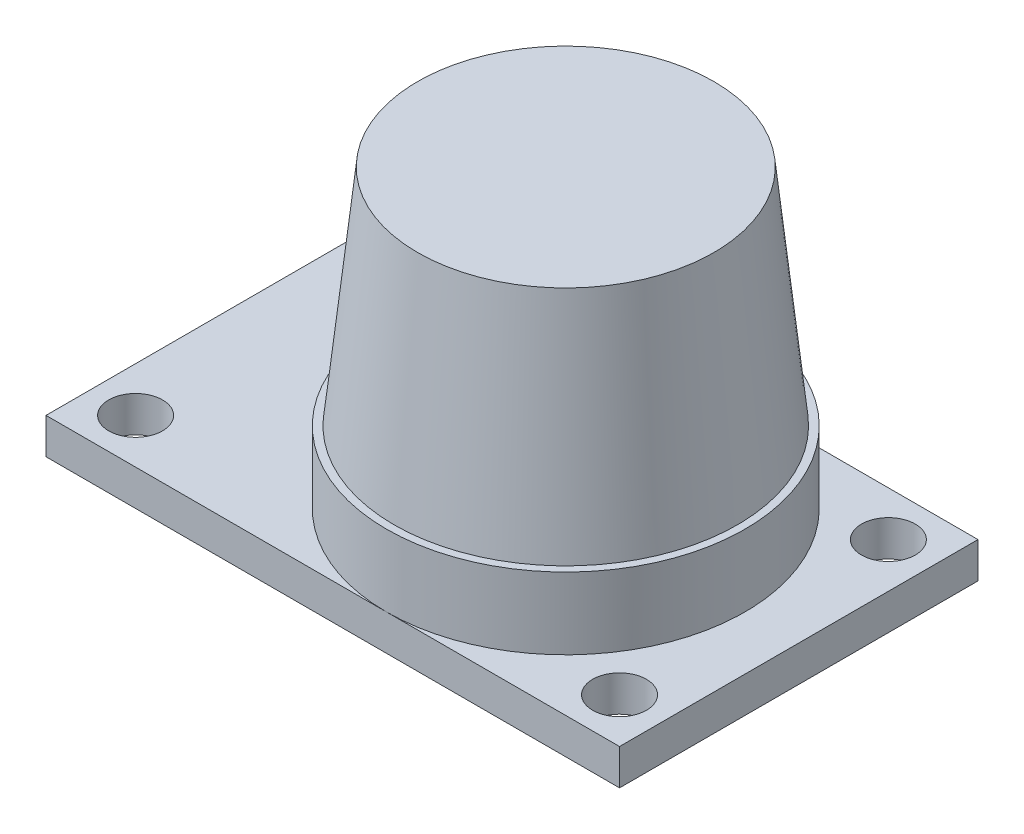
ISO-10303-21;
HEADER;
FILE_DESCRIPTION(('STEP AP214'),'2;1');
FILE_NAME('part.step','',(''),(''),'','','');
FILE_SCHEMA(('AUTOMOTIVE_DESIGN { 1 0 10303 214 1 1 1 1 }'));
ENDSEC;
DATA;
#1=APPLICATION_CONTEXT('core data for automotive mechanical design processes');
#2=APPLICATION_PROTOCOL_DEFINITION('international standard','automotive_design',2000,#1);
#3=PRODUCT_CONTEXT('',#1,'mechanical');
#4=PRODUCT('Part','Part','',(#3));
#5=PRODUCT_RELATED_PRODUCT_CATEGORY('part','',(#4));
#6=PRODUCT_DEFINITION_FORMATION('','',#4);
#7=PRODUCT_DEFINITION_CONTEXT('part definition',#1,'design');
#8=PRODUCT_DEFINITION('design','',#6,#7);
#9=PRODUCT_DEFINITION_SHAPE('','',#8);
#10=(LENGTH_UNIT() NAMED_UNIT(*) SI_UNIT(.MILLI.,.METRE.));
#11=(NAMED_UNIT(*) PLANE_ANGLE_UNIT() SI_UNIT($,.RADIAN.));
#12=(NAMED_UNIT(*) SI_UNIT($,.STERADIAN.) SOLID_ANGLE_UNIT());
#13=UNCERTAINTY_MEASURE_WITH_UNIT(LENGTH_MEASURE(1.E-05),#10,'distance_accuracy_value','');
#14=(GEOMETRIC_REPRESENTATION_CONTEXT(3) GLOBAL_UNCERTAINTY_ASSIGNED_CONTEXT((#13)) GLOBAL_UNIT_ASSIGNED_CONTEXT((#10,
#11,#12)) REPRESENTATION_CONTEXT('',''));
#15=CARTESIAN_POINT('',(0.,0.,0.));
#16=DIRECTION('',(0.,0.,1.));
#17=DIRECTION('',(1.,0.,0.));
#18=AXIS2_PLACEMENT_3D('',#15,#16,#17);
#19=CARTESIAN_POINT('',(0.,2.,0.));
#20=DIRECTION('',(0.,-1.,0.));
#21=DIRECTION('',(0.,0.,-1.));
#22=AXIS2_PLACEMENT_3D('',#19,#20,#21);
#23=PLANE('',#22);
#24=CARTESIAN_POINT('',(3.,2.,0.));
#25=DIRECTION('',(0.,1.,0.));
#26=DIRECTION('',(0.,0.,1.));
#27=AXIS2_PLACEMENT_3D('',#24,#25,#26);
#28=CIRCLE('',#27,10.);
#29=CARTESIAN_POINT('',(3.,2.,10.));
#30=VERTEX_POINT('',#29);
#31=CARTESIAN_POINT('',(3.,2.,-10.));
#32=VERTEX_POINT('',#31);
#33=EDGE_CURVE('E44',#30,#32,#28,.T.);
#34=ORIENTED_EDGE('',*,*,#33,.F.);
#35=DIRECTION('',(1.,0.,0.));
#36=VECTOR('',#35,1.);
#37=CARTESIAN_POINT('',(-16.,2.,10.));
#38=LINE('',#37,#36);
#39=CARTESIAN_POINT('',(16.,2.,10.));
#40=VERTEX_POINT('',#39);
#41=EDGE_CURVE('E58',#30,#40,#38,.T.);
#42=ORIENTED_EDGE('',*,*,#41,.T.);
#43=DIRECTION('',(0.,0.,-1.));
#44=VECTOR('',#43,1.);
#45=CARTESIAN_POINT('',(16.,2.,10.));
#46=LINE('',#45,#44);
#47=CARTESIAN_POINT('',(16.,2.,-10.));
#48=VERTEX_POINT('',#47);
#49=EDGE_CURVE('E162',#40,#48,#46,.T.);
#50=ORIENTED_EDGE('',*,*,#49,.T.);
#51=DIRECTION('',(-1.,0.,0.));
#52=VECTOR('',#51,1.);
#53=CARTESIAN_POINT('',(-16.,2.,-10.));
#54=LINE('',#53,#52);
#55=EDGE_CURVE('E87',#48,#32,#54,.T.);
#56=ORIENTED_EDGE('',*,*,#55,.T.);
#57=EDGE_LOOP('',(#34,#42,#50,#56));
#58=FACE_BOUND('',#57,.T.);
#59=CARTESIAN_POINT('',(13.5,2.,7.5));
#60=DIRECTION('',(0.,1.,0.));
#61=DIRECTION('',(0.,0.,1.));
#62=AXIS2_PLACEMENT_3D('',#59,#60,#61);
#63=CIRCLE('',#62,1.5);
#64=CARTESIAN_POINT('',(13.5,2.,9.));
#65=VERTEX_POINT('',#64);
#66=EDGE_CURVE('E188',#65,#65,#63,.T.);
#67=ORIENTED_EDGE('',*,*,#66,.F.);
#68=EDGE_LOOP('',(#67));
#69=FACE_BOUND('',#68,.T.);
#70=CARTESIAN_POINT('',(13.5,2.,-7.5));
#71=DIRECTION('',(0.,1.,0.));
#72=DIRECTION('',(0.,0.,1.));
#73=AXIS2_PLACEMENT_3D('',#70,#71,#72);
#74=CIRCLE('',#73,1.5);
#75=CARTESIAN_POINT('',(13.5,2.,-6.));
#76=VERTEX_POINT('',#75);
#77=EDGE_CURVE('E177',#76,#76,#74,.T.);
#78=ORIENTED_EDGE('',*,*,#77,.F.);
#79=EDGE_LOOP('',(#78));
#80=FACE_BOUND('',#79,.T.);
#81=ADVANCED_FACE('F33',(#58,#69,#80),#23,.F.);
#82=EDGE_CURVE('E11',#32,#30,#28,.T.);
#83=ORIENTED_EDGE('',*,*,#82,.F.);
#84=CARTESIAN_POINT('',(-16.,2.,-10.));
#85=VERTEX_POINT('',#84);
#86=EDGE_CURVE('E174',#32,#85,#54,.T.);
#87=ORIENTED_EDGE('',*,*,#86,.T.);
#88=DIRECTION('',(0.,0.,1.));
#89=VECTOR('',#88,1.);
#90=CARTESIAN_POINT('',(-16.,2.,10.));
#91=LINE('',#90,#89);
#92=CARTESIAN_POINT('',(-16.,2.,10.));
#93=VERTEX_POINT('',#92);
#94=EDGE_CURVE('E98',#85,#93,#91,.T.);
#95=ORIENTED_EDGE('',*,*,#94,.T.);
#96=EDGE_CURVE('E95',#93,#30,#38,.T.);
#97=ORIENTED_EDGE('',*,*,#96,.T.);
#98=EDGE_LOOP('',(#83,#87,#95,#97));
#99=FACE_BOUND('',#98,.T.);
#100=CARTESIAN_POINT('',(-13.5,2.,-7.5));
#101=DIRECTION('',(0.,1.,0.));
#102=DIRECTION('',(0.,0.,1.));
#103=AXIS2_PLACEMENT_3D('',#100,#101,#102);
#104=CIRCLE('',#103,1.5);
#105=CARTESIAN_POINT('',(-13.5,2.,-6.));
#106=VERTEX_POINT('',#105);
#107=EDGE_CURVE('E167',#106,#106,#104,.T.);
#108=ORIENTED_EDGE('',*,*,#107,.F.);
#109=EDGE_LOOP('',(#108));
#110=FACE_BOUND('',#109,.T.);
#111=CARTESIAN_POINT('',(-13.5,2.,7.5));
#112=DIRECTION('',(0.,1.,0.));
#113=DIRECTION('',(0.,0.,1.));
#114=AXIS2_PLACEMENT_3D('',#111,#112,#113);
#115=CIRCLE('',#114,1.5);
#116=CARTESIAN_POINT('',(-13.5,2.,9.));
#117=VERTEX_POINT('',#116);
#118=EDGE_CURVE('E182',#117,#117,#115,.T.);
#119=ORIENTED_EDGE('',*,*,#118,.F.);
#120=EDGE_LOOP('',(#119));
#121=FACE_BOUND('',#120,.T.);
#122=ADVANCED_FACE('F100',(#99,#110,#121),#23,.F.);
#123=CARTESIAN_POINT('',(0.,0.,0.));
#124=DIRECTION('',(0.,-1.,0.));
#125=DIRECTION('',(0.,0.,-1.));
#126=AXIS2_PLACEMENT_3D('',#123,#124,#125);
#127=PLANE('',#126);
#128=CARTESIAN_POINT('',(-13.5,0.,7.5));
#129=DIRECTION('',(0.,1.,0.));
#130=DIRECTION('',(0.,0.,1.));
#131=AXIS2_PLACEMENT_3D('',#128,#129,#130);
#132=CIRCLE('',#131,1.5);
#133=CARTESIAN_POINT('',(-13.5,0.,9.));
#134=VERTEX_POINT('',#133);
#135=EDGE_CURVE('E185',#134,#134,#132,.T.);
#136=ORIENTED_EDGE('',*,*,#135,.T.);
#137=EDGE_LOOP('',(#136));
#138=FACE_BOUND('',#137,.T.);
#139=CARTESIAN_POINT('',(-13.5,0.,-7.5));
#140=DIRECTION('',(0.,1.,0.));
#141=DIRECTION('',(0.,0.,1.));
#142=AXIS2_PLACEMENT_3D('',#139,#140,#141);
#143=CIRCLE('',#142,1.5);
#144=CARTESIAN_POINT('',(-13.5,0.,-6.));
#145=VERTEX_POINT('',#144);
#146=EDGE_CURVE('E169',#145,#145,#143,.T.);
#147=ORIENTED_EDGE('',*,*,#146,.T.);
#148=EDGE_LOOP('',(#147));
#149=FACE_BOUND('',#148,.T.);
#150=DIRECTION('',(0.,0.,-1.));
#151=VECTOR('',#150,1.);
#152=CARTESIAN_POINT('',(16.,0.,10.));
#153=LINE('',#152,#151);
#154=CARTESIAN_POINT('',(16.,0.,10.));
#155=VERTEX_POINT('',#154);
#156=CARTESIAN_POINT('',(16.,0.,-10.));
#157=VERTEX_POINT('',#156);
#158=EDGE_CURVE('E156',#155,#157,#153,.T.);
#159=ORIENTED_EDGE('',*,*,#158,.F.);
#160=DIRECTION('',(1.,0.,0.));
#161=VECTOR('',#160,1.);
#162=CARTESIAN_POINT('',(-16.,0.,10.));
#163=LINE('',#162,#161);
#164=CARTESIAN_POINT('',(-16.,0.,10.));
#165=VERTEX_POINT('',#164);
#166=EDGE_CURVE('E80',#165,#155,#163,.T.);
#167=ORIENTED_EDGE('',*,*,#166,.F.);
#168=DIRECTION('',(0.,0.,1.));
#169=VECTOR('',#168,1.);
#170=CARTESIAN_POINT('',(-16.,0.,10.));
#171=LINE('',#170,#169);
#172=CARTESIAN_POINT('',(-16.,0.,-10.));
#173=VERTEX_POINT('',#172);
#174=EDGE_CURVE('E155',#173,#165,#171,.T.);
#175=ORIENTED_EDGE('',*,*,#174,.F.);
#176=DIRECTION('',(-1.,0.,0.));
#177=VECTOR('',#176,1.);
#178=CARTESIAN_POINT('',(-16.,0.,-10.));
#179=LINE('',#178,#177);
#180=EDGE_CURVE('E147',#157,#173,#179,.T.);
#181=ORIENTED_EDGE('',*,*,#180,.F.);
#182=EDGE_LOOP('',(#159,#167,#175,#181));
#183=FACE_BOUND('',#182,.T.);
#184=CARTESIAN_POINT('',(13.5,0.,-7.5));
#185=DIRECTION('',(0.,1.,0.));
#186=DIRECTION('',(0.,0.,1.));
#187=AXIS2_PLACEMENT_3D('',#184,#185,#186);
#188=CIRCLE('',#187,1.5);
#189=CARTESIAN_POINT('',(13.5,0.,-6.));
#190=VERTEX_POINT('',#189);
#191=EDGE_CURVE('E179',#190,#190,#188,.T.);
#192=ORIENTED_EDGE('',*,*,#191,.T.);
#193=EDGE_LOOP('',(#192));
#194=FACE_BOUND('',#193,.T.);
#195=CARTESIAN_POINT('',(13.5,0.,7.5));
#196=DIRECTION('',(0.,1.,0.));
#197=DIRECTION('',(0.,0.,1.));
#198=AXIS2_PLACEMENT_3D('',#195,#196,#197);
#199=CIRCLE('',#198,1.5);
#200=CARTESIAN_POINT('',(13.5,0.,9.));
#201=VERTEX_POINT('',#200);
#202=EDGE_CURVE('E191',#201,#201,#199,.T.);
#203=ORIENTED_EDGE('',*,*,#202,.T.);
#204=EDGE_LOOP('',(#203));
#205=FACE_BOUND('',#204,.T.);
#206=ADVANCED_FACE('F127',(#138,#149,#183,#194,#205),#127,.T.);
#207=CARTESIAN_POINT('',(16.,2.,10.));
#208=DIRECTION('',(-1.,0.,0.));
#209=DIRECTION('',(0.,0.,1.));
#210=AXIS2_PLACEMENT_3D('',#207,#208,#209);
#211=PLANE('',#210);
#212=ORIENTED_EDGE('',*,*,#158,.T.);
#213=DIRECTION('',(0.,-1.,0.));
#214=VECTOR('',#213,1.);
#215=CARTESIAN_POINT('',(16.,2.,-10.));
#216=LINE('',#215,#214);
#217=EDGE_CURVE('E42',#48,#157,#216,.T.);
#218=ORIENTED_EDGE('',*,*,#217,.F.);
#219=ORIENTED_EDGE('',*,*,#49,.F.);
#220=DIRECTION('',(0.,-1.,0.));
#221=VECTOR('',#220,1.);
#222=CARTESIAN_POINT('',(16.,2.,10.));
#223=LINE('',#222,#221);
#224=EDGE_CURVE('E96',#40,#155,#223,.T.);
#225=ORIENTED_EDGE('',*,*,#224,.T.);
#226=EDGE_LOOP('',(#212,#218,#219,#225));
#227=FACE_BOUND('',#226,.T.);
#228=ADVANCED_FACE('F35',(#227),#211,.F.);
#229=CARTESIAN_POINT('',(-16.,2.,-10.));
#230=DIRECTION('',(0.,0.,1.));
#231=DIRECTION('',(1.,0.,0.));
#232=AXIS2_PLACEMENT_3D('',#229,#230,#231);
#233=PLANE('',#232);
#234=ORIENTED_EDGE('',*,*,#180,.T.);
#235=DIRECTION('',(0.,-1.,0.));
#236=VECTOR('',#235,1.);
#237=CARTESIAN_POINT('',(-16.,2.,-10.));
#238=LINE('',#237,#236);
#239=EDGE_CURVE('E149',#85,#173,#238,.T.);
#240=ORIENTED_EDGE('',*,*,#239,.F.);
#241=ORIENTED_EDGE('',*,*,#86,.F.);
#242=ORIENTED_EDGE('',*,*,#55,.F.);
#243=ORIENTED_EDGE('',*,*,#217,.T.);
#244=EDGE_LOOP('',(#234,#240,#241,#242,#243));
#245=FACE_BOUND('',#244,.T.);
#246=ADVANCED_FACE('F139',(#245),#233,.F.);
#247=CARTESIAN_POINT('',(-16.,2.,10.));
#248=DIRECTION('',(1.,0.,0.));
#249=DIRECTION('',(0.,0.,-1.));
#250=AXIS2_PLACEMENT_3D('',#247,#248,#249);
#251=PLANE('',#250);
#252=ORIENTED_EDGE('',*,*,#174,.T.);
#253=DIRECTION('',(0.,-1.,0.));
#254=VECTOR('',#253,1.);
#255=CARTESIAN_POINT('',(-16.,2.,10.));
#256=LINE('',#255,#254);
#257=EDGE_CURVE('E158',#93,#165,#256,.T.);
#258=ORIENTED_EDGE('',*,*,#257,.F.);
#259=ORIENTED_EDGE('',*,*,#94,.F.);
#260=ORIENTED_EDGE('',*,*,#239,.T.);
#261=EDGE_LOOP('',(#252,#258,#259,#260));
#262=FACE_BOUND('',#261,.T.);
#263=ADVANCED_FACE('F137',(#262),#251,.F.);
#264=CARTESIAN_POINT('',(-16.,2.,10.));
#265=DIRECTION('',(0.,0.,-1.));
#266=DIRECTION('',(-1.,0.,0.));
#267=AXIS2_PLACEMENT_3D('',#264,#265,#266);
#268=PLANE('',#267);
#269=ORIENTED_EDGE('',*,*,#166,.T.);
#270=ORIENTED_EDGE('',*,*,#224,.F.);
#271=ORIENTED_EDGE('',*,*,#41,.F.);
#272=ORIENTED_EDGE('',*,*,#96,.F.);
#273=ORIENTED_EDGE('',*,*,#257,.T.);
#274=EDGE_LOOP('',(#269,#270,#271,#272,#273));
#275=FACE_BOUND('',#274,.T.);
#276=ADVANCED_FACE('F94',(#275),#268,.F.);
#277=CARTESIAN_POINT('',(-13.5,2.,-7.5));
#278=DIRECTION('',(0.,-1.,0.));
#279=DIRECTION('',(0.,0.,-1.));
#280=AXIS2_PLACEMENT_3D('',#277,#278,#279);
#281=CYLINDRICAL_SURFACE('',#280,1.5);
#282=ORIENTED_EDGE('',*,*,#107,.T.);
#283=EDGE_LOOP('',(#282));
#284=FACE_BOUND('',#283,.T.);
#285=ORIENTED_EDGE('',*,*,#146,.F.);
#286=EDGE_LOOP('',(#285));
#287=FACE_BOUND('',#286,.T.);
#288=ADVANCED_FACE('F130',(#284,#287),#281,.F.);
#289=CARTESIAN_POINT('',(13.5,2.,-7.5));
#290=DIRECTION('',(0.,-1.,0.));
#291=DIRECTION('',(0.,0.,-1.));
#292=AXIS2_PLACEMENT_3D('',#289,#290,#291);
#293=CYLINDRICAL_SURFACE('',#292,1.5);
#294=ORIENTED_EDGE('',*,*,#77,.T.);
#295=EDGE_LOOP('',(#294));
#296=FACE_BOUND('',#295,.T.);
#297=ORIENTED_EDGE('',*,*,#191,.F.);
#298=EDGE_LOOP('',(#297));
#299=FACE_BOUND('',#298,.T.);
#300=ADVANCED_FACE('F215',(#296,#299),#293,.F.);
#301=CARTESIAN_POINT('',(-13.5,2.,7.5));
#302=DIRECTION('',(0.,-1.,0.));
#303=DIRECTION('',(0.,0.,-1.));
#304=AXIS2_PLACEMENT_3D('',#301,#302,#303);
#305=CYLINDRICAL_SURFACE('',#304,1.5);
#306=ORIENTED_EDGE('',*,*,#118,.T.);
#307=EDGE_LOOP('',(#306));
#308=FACE_BOUND('',#307,.T.);
#309=ORIENTED_EDGE('',*,*,#135,.F.);
#310=EDGE_LOOP('',(#309));
#311=FACE_BOUND('',#310,.T.);
#312=ADVANCED_FACE('F117',(#308,#311),#305,.F.);
#313=CARTESIAN_POINT('',(13.5,2.,7.5));
#314=DIRECTION('',(0.,-1.,0.));
#315=DIRECTION('',(0.,0.,-1.));
#316=AXIS2_PLACEMENT_3D('',#313,#314,#315);
#317=CYLINDRICAL_SURFACE('',#316,1.5);
#318=ORIENTED_EDGE('',*,*,#66,.T.);
#319=EDGE_LOOP('',(#318));
#320=FACE_BOUND('',#319,.T.);
#321=ORIENTED_EDGE('',*,*,#202,.F.);
#322=EDGE_LOOP('',(#321));
#323=FACE_BOUND('',#322,.T.);
#324=ADVANCED_FACE('F107',(#320,#323),#317,.F.);
#325=CARTESIAN_POINT('',(3.,6.,0.));
#326=DIRECTION('',(0.,-1.,0.));
#327=DIRECTION('',(0.,0.,-1.));
#328=AXIS2_PLACEMENT_3D('',#325,#326,#327);
#329=CYLINDRICAL_SURFACE('',#328,10.);
#330=CARTESIAN_POINT('',(3.,6.,0.));
#331=DIRECTION('',(0.,1.,0.));
#332=DIRECTION('',(0.,0.,1.));
#333=AXIS2_PLACEMENT_3D('',#330,#331,#332);
#334=CIRCLE('',#333,10.);
#335=CARTESIAN_POINT('',(3.,6.,10.));
#336=VERTEX_POINT('',#335);
#337=EDGE_CURVE('E198',#336,#336,#334,.T.);
#338=ORIENTED_EDGE('',*,*,#337,.F.);
#339=EDGE_LOOP('',(#338));
#340=FACE_BOUND('',#339,.T.);
#341=ORIENTED_EDGE('',*,*,#33,.T.);
#342=ORIENTED_EDGE('',*,*,#82,.T.);
#343=EDGE_LOOP('',(#341,#342));
#344=FACE_BOUND('',#343,.T.);
#345=ADVANCED_FACE('F104',(#340,#344),#329,.T.);
#346=CARTESIAN_POINT('',(3.,6.,0.));
#347=DIRECTION('',(0.,1.,0.));
#348=DIRECTION('',(0.,0.,1.));
#349=AXIS2_PLACEMENT_3D('',#346,#347,#348);
#350=PLANE('',#349);
#351=CARTESIAN_POINT('',(3.,6.,0.));
#352=DIRECTION('',(0.,1.,0.));
#353=DIRECTION('',(0.,0.,1.));
#354=AXIS2_PLACEMENT_3D('',#351,#352,#353);
#355=CIRCLE('',#354,9.5795830589373);
#356=CARTESIAN_POINT('',(3.,6.,9.5795830589373));
#357=VERTEX_POINT('',#356);
#358=EDGE_CURVE('E37',#357,#357,#355,.T.);
#359=ORIENTED_EDGE('',*,*,#358,.F.);
#360=EDGE_LOOP('',(#359));
#361=FACE_BOUND('',#360,.T.);
#362=ORIENTED_EDGE('',*,*,#337,.T.);
#363=EDGE_LOOP('',(#362));
#364=FACE_BOUND('',#363,.T.);
#365=ADVANCED_FACE('F106',(#361,#364),#350,.T.);
#366=CARTESIAN_POINT('',(3.,18.5,0.));
#367=DIRECTION('',(0.,1.,0.));
#368=DIRECTION('',(0.,0.,1.));
#369=AXIS2_PLACEMENT_3D('',#366,#367,#368);
#370=PLANE('',#369);
#371=CARTESIAN_POINT('',(3.,18.5,0.));
#372=DIRECTION('',(0.,1.,0.));
#373=DIRECTION('',(0.,0.,1.));
#374=AXIS2_PLACEMENT_3D('',#371,#372,#373);
#375=CIRCLE('',#374,8.26578011811634);
#376=CARTESIAN_POINT('',(3.,18.5,8.26578011811634));
#377=VERTEX_POINT('',#376);
#378=EDGE_CURVE('E92',#377,#377,#375,.T.);
#379=ORIENTED_EDGE('',*,*,#378,.T.);
#380=EDGE_LOOP('',(#379));
#381=FACE_BOUND('',#380,.T.);
#382=ADVANCED_FACE('F114',(#381),#370,.T.);
#383=CARTESIAN_POINT('',(3.,2.,0.));
#384=DIRECTION('',(0.,-1.,0.));
#385=DIRECTION('',(0.,0.,1.));
#386=AXIS2_PLACEMENT_3D('',#383,#384,#385);
#387=CONICAL_SURFACE('',#386,10.,0.10471975511966);
#388=ORIENTED_EDGE('',*,*,#358,.T.);
#389=EDGE_LOOP('',(#388));
#390=FACE_BOUND('',#389,.T.);
#391=ORIENTED_EDGE('',*,*,#378,.F.);
#392=EDGE_LOOP('',(#391));
#393=FACE_BOUND('',#392,.T.);
#394=ADVANCED_FACE('F204',(#390,#393),#387,.T.);
#395=CLOSED_SHELL('',(#81,#122,#206,#228,#246,#263,#276,#288,#300,#312,#324,#345,#365,#382,#394));
#396=MANIFOLD_SOLID_BREP('B2',#395);
#397=ADVANCED_BREP_SHAPE_REPRESENTATION('',(#18,#396),#14);
#398=SHAPE_DEFINITION_REPRESENTATION(#9,#397);
ENDSEC;
END-ISO-10303-21;
